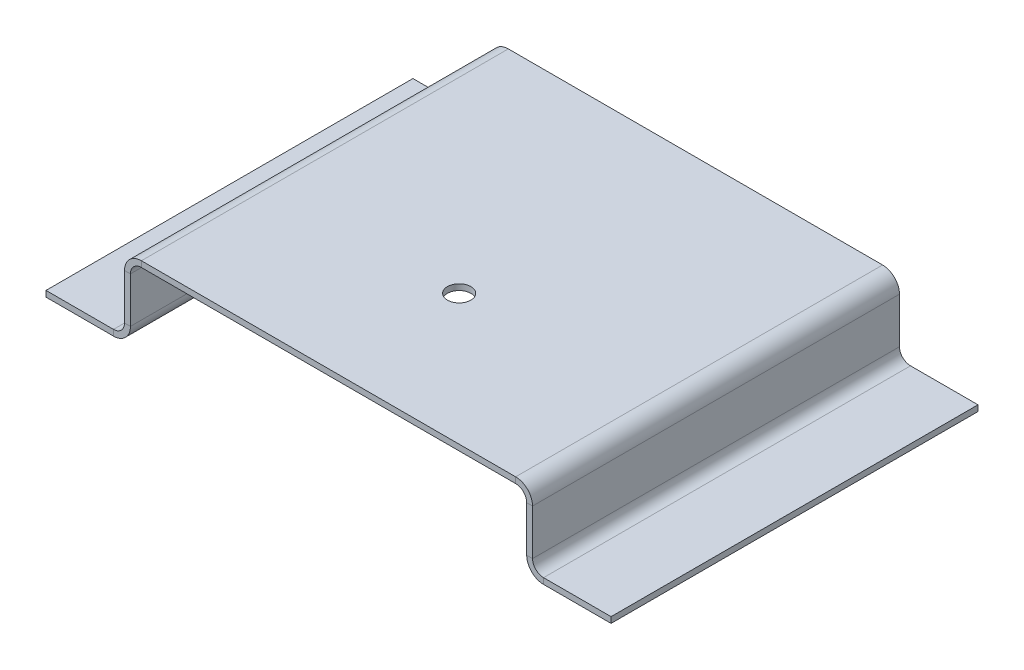
ISO-10303-21;
HEADER;
FILE_DESCRIPTION(('STEP AP214'),'2;1');
FILE_NAME('part.step','',(''),(''),'','','');
FILE_SCHEMA(('AUTOMOTIVE_DESIGN { 1 0 10303 214 1 1 1 1 }'));
ENDSEC;
DATA;
#1=APPLICATION_CONTEXT('core data for automotive mechanical design processes');
#2=APPLICATION_PROTOCOL_DEFINITION('international standard','automotive_design',2000,#1);
#3=PRODUCT_CONTEXT('',#1,'mechanical');
#4=PRODUCT('Part','Part','',(#3));
#5=PRODUCT_RELATED_PRODUCT_CATEGORY('part','',(#4));
#6=PRODUCT_DEFINITION_FORMATION('','',#4);
#7=PRODUCT_DEFINITION_CONTEXT('part definition',#1,'design');
#8=PRODUCT_DEFINITION('design','',#6,#7);
#9=PRODUCT_DEFINITION_SHAPE('','',#8);
#10=(LENGTH_UNIT() NAMED_UNIT(*) SI_UNIT(.MILLI.,.METRE.));
#11=(NAMED_UNIT(*) PLANE_ANGLE_UNIT() SI_UNIT($,.RADIAN.));
#12=(NAMED_UNIT(*) SI_UNIT($,.STERADIAN.) SOLID_ANGLE_UNIT());
#13=UNCERTAINTY_MEASURE_WITH_UNIT(LENGTH_MEASURE(1.E-05),#10,'distance_accuracy_value','');
#14=(GEOMETRIC_REPRESENTATION_CONTEXT(3) GLOBAL_UNCERTAINTY_ASSIGNED_CONTEXT((#13)) GLOBAL_UNIT_ASSIGNED_CONTEXT((#10,
#11,#12)) REPRESENTATION_CONTEXT('',''));
#15=CARTESIAN_POINT('',(0.,0.,0.));
#16=DIRECTION('',(0.,0.,1.));
#17=DIRECTION('',(1.,0.,0.));
#18=AXIS2_PLACEMENT_3D('',#15,#16,#17);
#19=CARTESIAN_POINT('',(27.,-7.7,25.));
#20=DIRECTION('',(0.,0.,1.));
#21=DIRECTION('',(1.,0.,0.));
#22=AXIS2_PLACEMENT_3D('',#19,#20,#21);
#23=PLANE('',#22);
#24=DIRECTION('',(1.,0.,0.));
#25=VECTOR('',#24,1.);
#26=CARTESIAN_POINT('',(27.,-7.7,25.));
#27=LINE('',#26,#25);
#28=CARTESIAN_POINT('',(27.,-7.7,25.));
#29=VERTEX_POINT('',#28);
#30=CARTESIAN_POINT('',(27.8,-7.7,25.));
#31=VERTEX_POINT('',#30);
#32=EDGE_CURVE('E11',#29,#31,#27,.T.);
#33=ORIENTED_EDGE('',*,*,#32,.F.);
#34=CARTESIAN_POINT('',(29.3,-7.7,25.));
#35=DIRECTION('',(0.,0.,1.));
#36=DIRECTION('',(1.,0.,0.));
#37=AXIS2_PLACEMENT_3D('',#34,#35,#36);
#38=CIRCLE('',#37,2.3);
#39=CARTESIAN_POINT('',(29.3,-10.,25.));
#40=VERTEX_POINT('',#39);
#41=EDGE_CURVE('E372',#40,#29,#38,.F.);
#42=ORIENTED_EDGE('',*,*,#41,.F.);
#43=DIRECTION('',(0.,-1.,0.));
#44=VECTOR('',#43,1.);
#45=CARTESIAN_POINT('',(29.3,-9.2,25.));
#46=LINE('',#45,#44);
#47=CARTESIAN_POINT('',(29.3,-9.2,25.));
#48=VERTEX_POINT('',#47);
#49=EDGE_CURVE('E50',#48,#40,#46,.T.);
#50=ORIENTED_EDGE('',*,*,#49,.F.);
#51=CARTESIAN_POINT('',(29.3,-7.7,25.));
#52=DIRECTION('',(0.,0.,1.));
#53=DIRECTION('',(1.,0.,0.));
#54=AXIS2_PLACEMENT_3D('',#51,#52,#53);
#55=CIRCLE('',#54,1.5);
#56=EDGE_CURVE('E385',#48,#31,#55,.F.);
#57=ORIENTED_EDGE('',*,*,#56,.T.);
#58=EDGE_LOOP('',(#33,#42,#50,#57));
#59=FACE_BOUND('',#58,.T.);
#60=ADVANCED_FACE('F42',(#59),#23,.T.);
#61=CARTESIAN_POINT('',(29.3,-9.2,25.));
#62=DIRECTION('',(0.,0.,1.));
#63=DIRECTION('',(1.,0.,0.));
#64=AXIS2_PLACEMENT_3D('',#61,#62,#63);
#65=PLANE('',#64);
#66=DIRECTION('',(0.,1.,0.));
#67=VECTOR('',#66,1.);
#68=CARTESIAN_POINT('',(27.,0.,25.));
#69=LINE('',#68,#67);
#70=CARTESIAN_POINT('',(27.,-1.5,25.));
#71=VERTEX_POINT('',#70);
#72=EDGE_CURVE('E376',#29,#71,#69,.T.);
#73=ORIENTED_EDGE('',*,*,#72,.F.);
#74=ORIENTED_EDGE('',*,*,#32,.T.);
#75=DIRECTION('',(0.,1.,0.));
#76=VECTOR('',#75,1.);
#77=CARTESIAN_POINT('',(27.8,0.,25.));
#78=LINE('',#77,#76);
#79=CARTESIAN_POINT('',(27.8,-1.5,25.));
#80=VERTEX_POINT('',#79);
#81=EDGE_CURVE('E387',#31,#80,#78,.T.);
#82=ORIENTED_EDGE('',*,*,#81,.T.);
#83=DIRECTION('',(-1.,0.,0.));
#84=VECTOR('',#83,1.);
#85=CARTESIAN_POINT('',(27.8,-1.5,25.));
#86=LINE('',#85,#84);
#87=EDGE_CURVE('E346',#80,#71,#86,.T.);
#88=ORIENTED_EDGE('',*,*,#87,.T.);
#89=EDGE_LOOP('',(#73,#74,#82,#88));
#90=FACE_BOUND('',#89,.T.);
#91=ADVANCED_FACE('F457',(#90),#65,.T.);
#92=CARTESIAN_POINT('',(29.3,-10.,-25.));
#93=DIRECTION('',(0.,0.,-1.));
#94=DIRECTION('',(-1.,0.,0.));
#95=AXIS2_PLACEMENT_3D('',#92,#93,#94);
#96=PLANE('',#95);
#97=DIRECTION('',(0.,1.,0.));
#98=VECTOR('',#97,1.);
#99=CARTESIAN_POINT('',(29.3,-10.,-25.));
#100=LINE('',#99,#98);
#101=CARTESIAN_POINT('',(29.3,-10.,-25.));
#102=VERTEX_POINT('',#101);
#103=CARTESIAN_POINT('',(29.3,-9.2,-25.));
#104=VERTEX_POINT('',#103);
#105=EDGE_CURVE('E352',#102,#104,#100,.T.);
#106=ORIENTED_EDGE('',*,*,#105,.F.);
#107=CARTESIAN_POINT('',(29.3,-7.7,-25.));
#108=DIRECTION('',(0.,0.,1.));
#109=DIRECTION('',(1.,0.,0.));
#110=AXIS2_PLACEMENT_3D('',#107,#108,#109);
#111=CIRCLE('',#110,2.3);
#112=CARTESIAN_POINT('',(27.,-7.7,-25.));
#113=VERTEX_POINT('',#112);
#114=EDGE_CURVE('E256',#102,#113,#111,.F.);
#115=ORIENTED_EDGE('',*,*,#114,.T.);
#116=DIRECTION('',(-1.,0.,0.));
#117=VECTOR('',#116,1.);
#118=CARTESIAN_POINT('',(27.8,-7.7,-25.));
#119=LINE('',#118,#117);
#120=CARTESIAN_POINT('',(27.8,-7.7,-25.));
#121=VERTEX_POINT('',#120);
#122=EDGE_CURVE('E350',#121,#113,#119,.T.);
#123=ORIENTED_EDGE('',*,*,#122,.F.);
#124=CARTESIAN_POINT('',(29.3,-7.7,-25.));
#125=DIRECTION('',(0.,0.,1.));
#126=DIRECTION('',(1.,0.,0.));
#127=AXIS2_PLACEMENT_3D('',#124,#125,#126);
#128=CIRCLE('',#127,1.5);
#129=EDGE_CURVE('E268',#104,#121,#128,.F.);
#130=ORIENTED_EDGE('',*,*,#129,.F.);
#131=EDGE_LOOP('',(#106,#115,#123,#130));
#132=FACE_BOUND('',#131,.T.);
#133=ADVANCED_FACE('F499',(#132),#96,.T.);
#134=CARTESIAN_POINT('',(27.8,-7.7,-25.));
#135=DIRECTION('',(0.,0.,-1.));
#136=DIRECTION('',(-1.,0.,0.));
#137=AXIS2_PLACEMENT_3D('',#134,#135,#136);
#138=PLANE('',#137);
#139=DIRECTION('',(-1.,0.,0.));
#140=VECTOR('',#139,1.);
#141=CARTESIAN_POINT('',(27.,-10.,-25.));
#142=LINE('',#141,#140);
#143=CARTESIAN_POINT('',(38.5,-9.99999999999999,-25.));
#144=VERTEX_POINT('',#143);
#145=EDGE_CURVE('E259',#144,#102,#142,.T.);
#146=ORIENTED_EDGE('',*,*,#145,.T.);
#147=ORIENTED_EDGE('',*,*,#105,.T.);
#148=DIRECTION('',(-1.,0.,0.));
#149=VECTOR('',#148,1.);
#150=CARTESIAN_POINT('',(27.,-9.2,-25.));
#151=LINE('',#150,#149);
#152=CARTESIAN_POINT('',(38.5,-9.2,-25.));
#153=VERTEX_POINT('',#152);
#154=EDGE_CURVE('E265',#153,#104,#151,.T.);
#155=ORIENTED_EDGE('',*,*,#154,.F.);
#156=DIRECTION('',(0.,-1.,0.));
#157=VECTOR('',#156,1.);
#158=CARTESIAN_POINT('',(38.5,-9.2,-25.));
#159=LINE('',#158,#157);
#160=EDGE_CURVE('E262',#153,#144,#159,.T.);
#161=ORIENTED_EDGE('',*,*,#160,.T.);
#162=EDGE_LOOP('',(#146,#147,#155,#161));
#163=FACE_BOUND('',#162,.T.);
#164=ADVANCED_FACE('F503',(#163),#138,.T.);
#165=CARTESIAN_POINT('',(25.5,0.,25.));
#166=DIRECTION('',(0.,0.,1.));
#167=DIRECTION('',(1.,0.,0.));
#168=AXIS2_PLACEMENT_3D('',#165,#166,#167);
#169=PLANE('',#168);
#170=DIRECTION('',(0.,1.,0.));
#171=VECTOR('',#170,1.);
#172=CARTESIAN_POINT('',(25.5,0.,25.));
#173=LINE('',#172,#171);
#174=CARTESIAN_POINT('',(25.5,0.,25.));
#175=VERTEX_POINT('',#174);
#176=CARTESIAN_POINT('',(25.5,0.800000000000002,25.));
#177=VERTEX_POINT('',#176);
#178=EDGE_CURVE('E348',#175,#177,#173,.T.);
#179=ORIENTED_EDGE('',*,*,#178,.F.);
#180=CARTESIAN_POINT('',(25.5,-1.5,25.));
#181=DIRECTION('',(0.,0.,-1.));
#182=DIRECTION('',(-1.,0.,0.));
#183=AXIS2_PLACEMENT_3D('',#180,#181,#182);
#184=CIRCLE('',#183,1.5);
#185=EDGE_CURVE('E447',#71,#175,#184,.F.);
#186=ORIENTED_EDGE('',*,*,#185,.F.);
#187=ORIENTED_EDGE('',*,*,#87,.F.);
#188=CARTESIAN_POINT('',(25.5,-1.5,25.));
#189=DIRECTION('',(0.,0.,1.));
#190=DIRECTION('',(1.,0.,0.));
#191=AXIS2_PLACEMENT_3D('',#188,#189,#190);
#192=CIRCLE('',#191,2.3);
#193=EDGE_CURVE('E390',#80,#177,#192,.T.);
#194=ORIENTED_EDGE('',*,*,#193,.T.);
#195=EDGE_LOOP('',(#179,#186,#187,#194));
#196=FACE_BOUND('',#195,.T.);
#197=ADVANCED_FACE('F464',(#196),#169,.T.);
#198=CARTESIAN_POINT('',(27.8,-1.5,25.));
#199=DIRECTION('',(0.,0.,1.));
#200=DIRECTION('',(1.,0.,0.));
#201=AXIS2_PLACEMENT_3D('',#198,#199,#200);
#202=PLANE('',#201);
#203=DIRECTION('',(-1.,0.,0.));
#204=VECTOR('',#203,1.);
#205=CARTESIAN_POINT('',(-27.,0.,25.));
#206=LINE('',#205,#204);
#207=CARTESIAN_POINT('',(-25.5,0.,25.));
#208=VERTEX_POINT('',#207);
#209=EDGE_CURVE('E444',#175,#208,#206,.T.);
#210=ORIENTED_EDGE('',*,*,#209,.F.);
#211=ORIENTED_EDGE('',*,*,#178,.T.);
#212=DIRECTION('',(1.,0.,0.));
#213=VECTOR('',#212,1.);
#214=CARTESIAN_POINT('',(-27.,0.800000000000002,25.));
#215=LINE('',#214,#213);
#216=CARTESIAN_POINT('',(-25.5,0.800000000000002,25.));
#217=VERTEX_POINT('',#216);
#218=EDGE_CURVE('E209',#177,#217,#215,.F.);
#219=ORIENTED_EDGE('',*,*,#218,.T.);
#220=DIRECTION('',(0.,-1.,0.));
#221=VECTOR('',#220,1.);
#222=CARTESIAN_POINT('',(-25.5,0.800000000000002,25.));
#223=LINE('',#222,#221);
#224=EDGE_CURVE('E200',#217,#208,#223,.T.);
#225=ORIENTED_EDGE('',*,*,#224,.T.);
#226=EDGE_LOOP('',(#210,#211,#219,#225));
#227=FACE_BOUND('',#226,.T.);
#228=ADVANCED_FACE('F396',(#227),#202,.T.);
#229=CARTESIAN_POINT('',(27.,-1.5,-25.));
#230=DIRECTION('',(0.,0.,-1.));
#231=DIRECTION('',(-1.,0.,0.));
#232=AXIS2_PLACEMENT_3D('',#229,#230,#231);
#233=PLANE('',#232);
#234=DIRECTION('',(1.,0.,0.));
#235=VECTOR('',#234,1.);
#236=CARTESIAN_POINT('',(27.,-1.5,-25.));
#237=LINE('',#236,#235);
#238=CARTESIAN_POINT('',(27.,-1.5,-25.));
#239=VERTEX_POINT('',#238);
#240=CARTESIAN_POINT('',(27.8,-1.5,-25.));
#241=VERTEX_POINT('',#240);
#242=EDGE_CURVE('E344',#239,#241,#237,.T.);
#243=ORIENTED_EDGE('',*,*,#242,.F.);
#244=CARTESIAN_POINT('',(25.5,-1.5,-25.));
#245=DIRECTION('',(0.,0.,-1.));
#246=DIRECTION('',(-1.,0.,0.));
#247=AXIS2_PLACEMENT_3D('',#244,#245,#246);
#248=CIRCLE('',#247,1.5);
#249=CARTESIAN_POINT('',(25.5,0.,-25.));
#250=VERTEX_POINT('',#249);
#251=EDGE_CURVE('E250',#239,#250,#248,.F.);
#252=ORIENTED_EDGE('',*,*,#251,.T.);
#253=DIRECTION('',(0.,-1.,0.));
#254=VECTOR('',#253,1.);
#255=CARTESIAN_POINT('',(25.5,0.800000000000002,-25.));
#256=LINE('',#255,#254);
#257=CARTESIAN_POINT('',(25.5,0.800000000000002,-25.));
#258=VERTEX_POINT('',#257);
#259=EDGE_CURVE('E199',#258,#250,#256,.T.);
#260=ORIENTED_EDGE('',*,*,#259,.F.);
#261=CARTESIAN_POINT('',(25.5,-1.5,-25.));
#262=DIRECTION('',(0.,0.,1.));
#263=DIRECTION('',(1.,0.,0.));
#264=AXIS2_PLACEMENT_3D('',#261,#262,#263);
#265=CIRCLE('',#264,2.3);
#266=EDGE_CURVE('E274',#241,#258,#265,.T.);
#267=ORIENTED_EDGE('',*,*,#266,.F.);
#268=EDGE_LOOP('',(#243,#252,#260,#267));
#269=FACE_BOUND('',#268,.T.);
#270=ADVANCED_FACE('F473',(#269),#233,.T.);
#271=CARTESIAN_POINT('',(25.5,0.800000000000002,-25.));
#272=DIRECTION('',(0.,0.,-1.));
#273=DIRECTION('',(-1.,0.,0.));
#274=AXIS2_PLACEMENT_3D('',#271,#272,#273);
#275=PLANE('',#274);
#276=DIRECTION('',(0.,1.,0.));
#277=VECTOR('',#276,1.);
#278=CARTESIAN_POINT('',(27.,0.,-25.));
#279=LINE('',#278,#277);
#280=EDGE_CURVE('E253',#113,#239,#279,.T.);
#281=ORIENTED_EDGE('',*,*,#280,.T.);
#282=ORIENTED_EDGE('',*,*,#242,.T.);
#283=DIRECTION('',(0.,1.,0.));
#284=VECTOR('',#283,1.);
#285=CARTESIAN_POINT('',(27.8,0.,-25.));
#286=LINE('',#285,#284);
#287=EDGE_CURVE('E271',#121,#241,#286,.T.);
#288=ORIENTED_EDGE('',*,*,#287,.F.);
#289=ORIENTED_EDGE('',*,*,#122,.T.);
#290=EDGE_LOOP('',(#281,#282,#288,#289));
#291=FACE_BOUND('',#290,.T.);
#292=ADVANCED_FACE('F477',(#291),#275,.T.);
#293=CARTESIAN_POINT('',(-27.,-1.5,25.));
#294=DIRECTION('',(0.,0.,1.));
#295=DIRECTION('',(1.,0.,0.));
#296=AXIS2_PLACEMENT_3D('',#293,#294,#295);
#297=PLANE('',#296);
#298=DIRECTION('',(-1.,0.,0.));
#299=VECTOR('',#298,1.);
#300=CARTESIAN_POINT('',(-27.,-1.5,25.));
#301=LINE('',#300,#299);
#302=CARTESIAN_POINT('',(-27.,-1.5,25.));
#303=VERTEX_POINT('',#302);
#304=CARTESIAN_POINT('',(-27.8,-1.5,25.));
#305=VERTEX_POINT('',#304);
#306=EDGE_CURVE('E187',#303,#305,#301,.T.);
#307=ORIENTED_EDGE('',*,*,#306,.F.);
#308=CARTESIAN_POINT('',(-25.5,-1.5,25.));
#309=DIRECTION('',(0.,0.,-1.));
#310=DIRECTION('',(-1.,0.,0.));
#311=AXIS2_PLACEMENT_3D('',#308,#309,#310);
#312=CIRCLE('',#311,1.5);
#313=EDGE_CURVE('E408',#208,#303,#312,.F.);
#314=ORIENTED_EDGE('',*,*,#313,.F.);
#315=ORIENTED_EDGE('',*,*,#224,.F.);
#316=CARTESIAN_POINT('',(-25.5,-1.5,25.));
#317=DIRECTION('',(0.,0.,1.));
#318=DIRECTION('',(1.,0.,0.));
#319=AXIS2_PLACEMENT_3D('',#316,#317,#318);
#320=CIRCLE('',#319,2.3);
#321=EDGE_CURVE('E203',#217,#305,#320,.T.);
#322=ORIENTED_EDGE('',*,*,#321,.T.);
#323=EDGE_LOOP('',(#307,#314,#315,#322));
#324=FACE_BOUND('',#323,.T.);
#325=ADVANCED_FACE('F205',(#324),#297,.T.);
#326=CARTESIAN_POINT('',(-25.5,0.800000000000002,25.));
#327=DIRECTION('',(0.,0.,1.));
#328=DIRECTION('',(1.,0.,0.));
#329=AXIS2_PLACEMENT_3D('',#326,#327,#328);
#330=PLANE('',#329);
#331=DIRECTION('',(0.,-1.,0.));
#332=VECTOR('',#331,1.);
#333=CARTESIAN_POINT('',(-27.,0.,25.));
#334=LINE('',#333,#332);
#335=CARTESIAN_POINT('',(-27.,-7.7,25.));
#336=VERTEX_POINT('',#335);
#337=EDGE_CURVE('E194',#303,#336,#334,.T.);
#338=ORIENTED_EDGE('',*,*,#337,.F.);
#339=ORIENTED_EDGE('',*,*,#306,.T.);
#340=DIRECTION('',(0.,1.,0.));
#341=VECTOR('',#340,1.);
#342=CARTESIAN_POINT('',(-27.8,0.,25.));
#343=LINE('',#342,#341);
#344=CARTESIAN_POINT('',(-27.8,-7.7,25.));
#345=VERTEX_POINT('',#344);
#346=EDGE_CURVE('E191',#305,#345,#343,.F.);
#347=ORIENTED_EDGE('',*,*,#346,.T.);
#348=DIRECTION('',(1.,0.,0.));
#349=VECTOR('',#348,1.);
#350=CARTESIAN_POINT('',(-27.8,-7.7,25.));
#351=LINE('',#350,#349);
#352=EDGE_CURVE('E335',#345,#336,#351,.T.);
#353=ORIENTED_EDGE('',*,*,#352,.T.);
#354=EDGE_LOOP('',(#338,#339,#347,#353));
#355=FACE_BOUND('',#354,.T.);
#356=ADVANCED_FACE('F189',(#355),#330,.T.);
#357=CARTESIAN_POINT('',(-25.5,0.,-25.));
#358=DIRECTION('',(0.,0.,-1.));
#359=DIRECTION('',(-1.,0.,0.));
#360=AXIS2_PLACEMENT_3D('',#357,#358,#359);
#361=PLANE('',#360);
#362=DIRECTION('',(0.,1.,0.));
#363=VECTOR('',#362,1.);
#364=CARTESIAN_POINT('',(-25.5,0.,-25.));
#365=LINE('',#364,#363);
#366=CARTESIAN_POINT('',(-25.5,0.,-25.));
#367=VERTEX_POINT('',#366);
#368=CARTESIAN_POINT('',(-25.5,0.800000000000002,-25.));
#369=VERTEX_POINT('',#368);
#370=EDGE_CURVE('E340',#367,#369,#365,.T.);
#371=ORIENTED_EDGE('',*,*,#370,.F.);
#372=CARTESIAN_POINT('',(-25.5,-1.5,-25.));
#373=DIRECTION('',(0.,0.,-1.));
#374=DIRECTION('',(-1.,0.,0.));
#375=AXIS2_PLACEMENT_3D('',#372,#373,#374);
#376=CIRCLE('',#375,1.5);
#377=CARTESIAN_POINT('',(-27.,-1.5,-25.));
#378=VERTEX_POINT('',#377);
#379=EDGE_CURVE('E244',#367,#378,#376,.F.);
#380=ORIENTED_EDGE('',*,*,#379,.T.);
#381=DIRECTION('',(1.,0.,0.));
#382=VECTOR('',#381,1.);
#383=CARTESIAN_POINT('',(-27.8,-1.5,-25.));
#384=LINE('',#383,#382);
#385=CARTESIAN_POINT('',(-27.8,-1.5,-25.));
#386=VERTEX_POINT('',#385);
#387=EDGE_CURVE('E338',#386,#378,#384,.T.);
#388=ORIENTED_EDGE('',*,*,#387,.F.);
#389=CARTESIAN_POINT('',(-25.5,-1.5,-25.));
#390=DIRECTION('',(0.,0.,1.));
#391=DIRECTION('',(1.,0.,0.));
#392=AXIS2_PLACEMENT_3D('',#389,#390,#391);
#393=CIRCLE('',#392,2.3);
#394=EDGE_CURVE('E216',#369,#386,#393,.T.);
#395=ORIENTED_EDGE('',*,*,#394,.F.);
#396=EDGE_LOOP('',(#371,#380,#388,#395));
#397=FACE_BOUND('',#396,.T.);
#398=ADVANCED_FACE('F402',(#397),#361,.T.);
#399=CARTESIAN_POINT('',(-27.8,-1.5,-25.));
#400=DIRECTION('',(0.,0.,-1.));
#401=DIRECTION('',(-1.,0.,0.));
#402=AXIS2_PLACEMENT_3D('',#399,#400,#401);
#403=PLANE('',#402);
#404=DIRECTION('',(-1.,0.,0.));
#405=VECTOR('',#404,1.);
#406=CARTESIAN_POINT('',(-27.,0.,-25.));
#407=LINE('',#406,#405);
#408=EDGE_CURVE('E247',#250,#367,#407,.T.);
#409=ORIENTED_EDGE('',*,*,#408,.T.);
#410=ORIENTED_EDGE('',*,*,#370,.T.);
#411=DIRECTION('',(1.,0.,0.));
#412=VECTOR('',#411,1.);
#413=CARTESIAN_POINT('',(-27.,0.800000000000002,-25.));
#414=LINE('',#413,#412);
#415=EDGE_CURVE('E277',#258,#369,#414,.F.);
#416=ORIENTED_EDGE('',*,*,#415,.F.);
#417=ORIENTED_EDGE('',*,*,#259,.T.);
#418=EDGE_LOOP('',(#409,#410,#416,#417));
#419=FACE_BOUND('',#418,.T.);
#420=ADVANCED_FACE('F483',(#419),#403,.T.);
#421=CARTESIAN_POINT('',(-29.3,-10.,25.));
#422=DIRECTION('',(0.,0.,1.));
#423=DIRECTION('',(1.,0.,0.));
#424=AXIS2_PLACEMENT_3D('',#421,#422,#423);
#425=PLANE('',#424);
#426=DIRECTION('',(0.,1.,0.));
#427=VECTOR('',#426,1.);
#428=CARTESIAN_POINT('',(-29.3,-10.,25.));
#429=LINE('',#428,#427);
#430=CARTESIAN_POINT('',(-29.3,-10.,25.));
#431=VERTEX_POINT('',#430);
#432=CARTESIAN_POINT('',(-29.3,-9.2,25.));
#433=VERTEX_POINT('',#432);
#434=EDGE_CURVE('E58',#431,#433,#429,.T.);
#435=ORIENTED_EDGE('',*,*,#434,.F.);
#436=CARTESIAN_POINT('',(-29.3,-7.7,25.));
#437=DIRECTION('',(0.,0.,1.));
#438=DIRECTION('',(1.,0.,0.));
#439=AXIS2_PLACEMENT_3D('',#436,#437,#438);
#440=CIRCLE('',#439,2.3);
#441=EDGE_CURVE('E436',#336,#431,#440,.F.);
#442=ORIENTED_EDGE('',*,*,#441,.F.);
#443=ORIENTED_EDGE('',*,*,#352,.F.);
#444=CARTESIAN_POINT('',(-29.3,-7.7,25.));
#445=DIRECTION('',(0.,0.,1.));
#446=DIRECTION('',(1.,0.,0.));
#447=AXIS2_PLACEMENT_3D('',#444,#445,#446);
#448=CIRCLE('',#447,1.5);
#449=EDGE_CURVE('E224',#345,#433,#448,.F.);
#450=ORIENTED_EDGE('',*,*,#449,.T.);
#451=EDGE_LOOP('',(#435,#442,#443,#450));
#452=FACE_BOUND('',#451,.T.);
#453=ADVANCED_FACE('F485',(#452),#425,.T.);
#454=CARTESIAN_POINT('',(-27.8,-7.7,25.));
#455=DIRECTION('',(0.,0.,1.));
#456=DIRECTION('',(1.,0.,0.));
#457=AXIS2_PLACEMENT_3D('',#454,#455,#456);
#458=PLANE('',#457);
#459=DIRECTION('',(-1.,0.,0.));
#460=VECTOR('',#459,1.);
#461=CARTESIAN_POINT('',(-27.,-10.,25.));
#462=LINE('',#461,#460);
#463=CARTESIAN_POINT('',(-38.5,-10.,25.));
#464=VERTEX_POINT('',#463);
#465=EDGE_CURVE('E434',#431,#464,#462,.T.);
#466=ORIENTED_EDGE('',*,*,#465,.F.);
#467=ORIENTED_EDGE('',*,*,#434,.T.);
#468=DIRECTION('',(-1.,0.,0.));
#469=VECTOR('',#468,1.);
#470=CARTESIAN_POINT('',(-27.,-9.2,25.));
#471=LINE('',#470,#469);
#472=CARTESIAN_POINT('',(-38.5,-9.2,25.));
#473=VERTEX_POINT('',#472);
#474=EDGE_CURVE('E136',#433,#473,#471,.T.);
#475=ORIENTED_EDGE('',*,*,#474,.T.);
#476=DIRECTION('',(0.,1.,0.));
#477=VECTOR('',#476,1.);
#478=CARTESIAN_POINT('',(-38.5,-10.,25.));
#479=LINE('',#478,#477);
#480=EDGE_CURVE('E432',#464,#473,#479,.T.);
#481=ORIENTED_EDGE('',*,*,#480,.F.);
#482=EDGE_LOOP('',(#466,#467,#475,#481));
#483=FACE_BOUND('',#482,.T.);
#484=ADVANCED_FACE('F491',(#483),#458,.T.);
#485=CARTESIAN_POINT('',(-27.,-7.7,-25.));
#486=DIRECTION('',(0.,0.,-1.));
#487=DIRECTION('',(-1.,0.,0.));
#488=AXIS2_PLACEMENT_3D('',#485,#486,#487);
#489=PLANE('',#488);
#490=DIRECTION('',(-1.,0.,0.));
#491=VECTOR('',#490,1.);
#492=CARTESIAN_POINT('',(-27.,-7.7,-25.));
#493=LINE('',#492,#491);
#494=CARTESIAN_POINT('',(-27.,-7.7,-25.));
#495=VERTEX_POINT('',#494);
#496=CARTESIAN_POINT('',(-27.8,-7.7,-25.));
#497=VERTEX_POINT('',#496);
#498=EDGE_CURVE('E123',#495,#497,#493,.T.);
#499=ORIENTED_EDGE('',*,*,#498,.F.);
#500=CARTESIAN_POINT('',(-29.3,-7.7,-25.));
#501=DIRECTION('',(0.,0.,1.));
#502=DIRECTION('',(1.,0.,0.));
#503=AXIS2_PLACEMENT_3D('',#500,#501,#502);
#504=CIRCLE('',#503,2.3);
#505=CARTESIAN_POINT('',(-29.3,-10.,-25.));
#506=VERTEX_POINT('',#505);
#507=EDGE_CURVE('E240',#495,#506,#504,.F.);
#508=ORIENTED_EDGE('',*,*,#507,.T.);
#509=DIRECTION('',(0.,-1.,0.));
#510=VECTOR('',#509,1.);
#511=CARTESIAN_POINT('',(-29.3,-9.2,-25.));
#512=LINE('',#511,#510);
#513=CARTESIAN_POINT('',(-29.3,-9.2,-25.));
#514=VERTEX_POINT('',#513);
#515=EDGE_CURVE('E130',#514,#506,#512,.T.);
#516=ORIENTED_EDGE('',*,*,#515,.F.);
#517=CARTESIAN_POINT('',(-29.3,-7.7,-25.));
#518=DIRECTION('',(0.,0.,1.));
#519=DIRECTION('',(1.,0.,0.));
#520=AXIS2_PLACEMENT_3D('',#517,#518,#519);
#521=CIRCLE('',#520,1.5);
#522=EDGE_CURVE('E283',#497,#514,#521,.F.);
#523=ORIENTED_EDGE('',*,*,#522,.F.);
#524=EDGE_LOOP('',(#499,#508,#516,#523));
#525=FACE_BOUND('',#524,.T.);
#526=ADVANCED_FACE('F419',(#525),#489,.T.);
#527=CARTESIAN_POINT('',(-29.3,-9.2,-25.));
#528=DIRECTION('',(0.,0.,-1.));
#529=DIRECTION('',(-1.,0.,0.));
#530=AXIS2_PLACEMENT_3D('',#527,#528,#529);
#531=PLANE('',#530);
#532=DIRECTION('',(0.,-1.,0.));
#533=VECTOR('',#532,1.);
#534=CARTESIAN_POINT('',(-27.,0.,-25.));
#535=LINE('',#534,#533);
#536=EDGE_CURVE('E242',#378,#495,#535,.T.);
#537=ORIENTED_EDGE('',*,*,#536,.T.);
#538=ORIENTED_EDGE('',*,*,#498,.T.);
#539=DIRECTION('',(0.,1.,0.));
#540=VECTOR('',#539,1.);
#541=CARTESIAN_POINT('',(-27.8,0.,-25.));
#542=LINE('',#541,#540);
#543=EDGE_CURVE('E281',#386,#497,#542,.F.);
#544=ORIENTED_EDGE('',*,*,#543,.F.);
#545=ORIENTED_EDGE('',*,*,#387,.T.);
#546=EDGE_LOOP('',(#537,#538,#544,#545));
#547=FACE_BOUND('',#546,.T.);
#548=ADVANCED_FACE('F404',(#547),#531,.T.);
#549=CARTESIAN_POINT('',(-27.,-9.2,25.));
#550=DIRECTION('',(0.,-1.,0.));
#551=DIRECTION('',(1.,0.,0.));
#552=AXIS2_PLACEMENT_3D('',#549,#550,#551);
#553=PLANE('',#552);
#554=DIRECTION('',(-1.,0.,0.));
#555=VECTOR('',#554,1.);
#556=CARTESIAN_POINT('',(-27.,-9.2,-25.));
#557=LINE('',#556,#555);
#558=CARTESIAN_POINT('',(-38.5,-9.2,-25.));
#559=VERTEX_POINT('',#558);
#560=EDGE_CURVE('E230',#514,#559,#557,.T.);
#561=ORIENTED_EDGE('',*,*,#560,.T.);
#562=DIRECTION('',(0.,0.,-1.));
#563=VECTOR('',#562,1.);
#564=CARTESIAN_POINT('',(-38.5,-9.2,25.));
#565=LINE('',#564,#563);
#566=EDGE_CURVE('E331',#473,#559,#565,.T.);
#567=ORIENTED_EDGE('',*,*,#566,.F.);
#568=ORIENTED_EDGE('',*,*,#474,.F.);
#569=DIRECTION('',(0.,0.,-1.));
#570=VECTOR('',#569,1.);
#571=CARTESIAN_POINT('',(-29.3,-9.2,25.));
#572=LINE('',#571,#570);
#573=EDGE_CURVE('E226',#433,#514,#572,.T.);
#574=ORIENTED_EDGE('',*,*,#573,.T.);
#575=EDGE_LOOP('',(#561,#567,#568,#574));
#576=FACE_BOUND('',#575,.T.);
#577=ADVANCED_FACE('F425',(#576),#553,.F.);
#578=CARTESIAN_POINT('',(-38.5,-10.,25.));
#579=DIRECTION('',(-1.,0.,0.));
#580=DIRECTION('',(0.,0.,1.));
#581=AXIS2_PLACEMENT_3D('',#578,#579,#580);
#582=PLANE('',#581);
#583=DIRECTION('',(0.,1.,0.));
#584=VECTOR('',#583,1.);
#585=CARTESIAN_POINT('',(-38.5,-10.,-25.));
#586=LINE('',#585,#584);
#587=CARTESIAN_POINT('',(-38.5,-10.,-25.));
#588=VERTEX_POINT('',#587);
#589=EDGE_CURVE('E233',#588,#559,#586,.T.);
#590=ORIENTED_EDGE('',*,*,#589,.F.);
#591=DIRECTION('',(0.,0.,-1.));
#592=VECTOR('',#591,1.);
#593=CARTESIAN_POINT('',(-38.5,-10.,25.));
#594=LINE('',#593,#592);
#595=EDGE_CURVE('E329',#464,#588,#594,.T.);
#596=ORIENTED_EDGE('',*,*,#595,.F.);
#597=ORIENTED_EDGE('',*,*,#480,.T.);
#598=ORIENTED_EDGE('',*,*,#566,.T.);
#599=EDGE_LOOP('',(#590,#596,#597,#598));
#600=FACE_BOUND('',#599,.T.);
#601=ADVANCED_FACE('F430',(#600),#582,.T.);
#602=CARTESIAN_POINT('',(-27.,-10.,25.));
#603=DIRECTION('',(0.,-1.,0.));
#604=DIRECTION('',(1.,0.,0.));
#605=AXIS2_PLACEMENT_3D('',#602,#603,#604);
#606=PLANE('',#605);
#607=DIRECTION('',(-1.,0.,0.));
#608=VECTOR('',#607,1.);
#609=CARTESIAN_POINT('',(-27.,-10.,-25.));
#610=LINE('',#609,#608);
#611=EDGE_CURVE('E237',#506,#588,#610,.T.);
#612=ORIENTED_EDGE('',*,*,#611,.F.);
#613=DIRECTION('',(0.,0.,-1.));
#614=VECTOR('',#613,1.);
#615=CARTESIAN_POINT('',(-29.3,-10.,25.));
#616=LINE('',#615,#614);
#617=EDGE_CURVE('E326',#431,#506,#616,.T.);
#618=ORIENTED_EDGE('',*,*,#617,.F.);
#619=ORIENTED_EDGE('',*,*,#465,.T.);
#620=ORIENTED_EDGE('',*,*,#595,.T.);
#621=EDGE_LOOP('',(#612,#618,#619,#620));
#622=FACE_BOUND('',#621,.T.);
#623=ADVANCED_FACE('F586',(#622),#606,.T.);
#624=CARTESIAN_POINT('',(-29.3,-7.7,25.));
#625=DIRECTION('',(0.,0.,-1.));
#626=DIRECTION('',(-1.,0.,0.));
#627=AXIS2_PLACEMENT_3D('',#624,#625,#626);
#628=CYLINDRICAL_SURFACE('',#627,2.3);
#629=ORIENTED_EDGE('',*,*,#507,.F.);
#630=DIRECTION('',(0.,0.,-1.));
#631=VECTOR('',#630,1.);
#632=CARTESIAN_POINT('',(-27.,-7.7,25.));
#633=LINE('',#632,#631);
#634=EDGE_CURVE('E323',#336,#495,#633,.T.);
#635=ORIENTED_EDGE('',*,*,#634,.F.);
#636=ORIENTED_EDGE('',*,*,#441,.T.);
#637=ORIENTED_EDGE('',*,*,#617,.T.);
#638=EDGE_LOOP('',(#629,#635,#636,#637));
#639=FACE_BOUND('',#638,.T.);
#640=ADVANCED_FACE('F416',(#639),#628,.T.);
#641=CARTESIAN_POINT('',(-27.,0.,25.));
#642=DIRECTION('',(1.,0.,0.));
#643=DIRECTION('',(0.,0.,-1.));
#644=AXIS2_PLACEMENT_3D('',#641,#642,#643);
#645=PLANE('',#644);
#646=ORIENTED_EDGE('',*,*,#536,.F.);
#647=DIRECTION('',(0.,0.,-1.));
#648=VECTOR('',#647,1.);
#649=CARTESIAN_POINT('',(-27.,-1.5,25.));
#650=LINE('',#649,#648);
#651=EDGE_CURVE('E320',#303,#378,#650,.T.);
#652=ORIENTED_EDGE('',*,*,#651,.F.);
#653=ORIENTED_EDGE('',*,*,#337,.T.);
#654=ORIENTED_EDGE('',*,*,#634,.T.);
#655=EDGE_LOOP('',(#646,#652,#653,#654));
#656=FACE_BOUND('',#655,.T.);
#657=ADVANCED_FACE('F410',(#656),#645,.T.);
#658=CARTESIAN_POINT('',(-25.5,-1.5,25.));
#659=DIRECTION('',(0.,0.,-1.));
#660=DIRECTION('',(-1.,0.,0.));
#661=AXIS2_PLACEMENT_3D('',#658,#659,#660);
#662=CYLINDRICAL_SURFACE('',#661,1.5);
#663=ORIENTED_EDGE('',*,*,#379,.F.);
#664=DIRECTION('',(0.,0.,-1.));
#665=VECTOR('',#664,1.);
#666=CARTESIAN_POINT('',(-25.5,0.,25.));
#667=LINE('',#666,#665);
#668=EDGE_CURVE('E317',#208,#367,#667,.T.);
#669=ORIENTED_EDGE('',*,*,#668,.F.);
#670=ORIENTED_EDGE('',*,*,#313,.T.);
#671=ORIENTED_EDGE('',*,*,#651,.T.);
#672=EDGE_LOOP('',(#663,#669,#670,#671));
#673=FACE_BOUND('',#672,.T.);
#674=ADVANCED_FACE('F407',(#673),#662,.F.);
#675=CARTESIAN_POINT('',(-27.,0.,25.));
#676=DIRECTION('',(0.,-1.,0.));
#677=DIRECTION('',(0.,0.,-1.));
#678=AXIS2_PLACEMENT_3D('',#675,#676,#677);
#679=PLANE('',#678);
#680=CARTESIAN_POINT('',(0.,0.,7.2));
#681=DIRECTION('',(0.,-1.,0.));
#682=DIRECTION('',(0.,0.,-1.));
#683=AXIS2_PLACEMENT_3D('',#680,#681,#682);
#684=CIRCLE('',#683,1.6);
#685=CARTESIAN_POINT('',(0.,0.,5.6));
#686=VERTEX_POINT('',#685);
#687=EDGE_CURVE('E234',#686,#686,#684,.T.);
#688=ORIENTED_EDGE('',*,*,#687,.F.);
#689=EDGE_LOOP('',(#688));
#690=FACE_BOUND('',#689,.T.);
#691=ORIENTED_EDGE('',*,*,#408,.F.);
#692=DIRECTION('',(0.,0.,-1.));
#693=VECTOR('',#692,1.);
#694=CARTESIAN_POINT('',(25.5,0.,25.));
#695=LINE('',#694,#693);
#696=EDGE_CURVE('E314',#175,#250,#695,.T.);
#697=ORIENTED_EDGE('',*,*,#696,.F.);
#698=ORIENTED_EDGE('',*,*,#209,.T.);
#699=ORIENTED_EDGE('',*,*,#668,.T.);
#700=EDGE_LOOP('',(#691,#697,#698,#699));
#701=FACE_BOUND('',#700,.T.);
#702=ADVANCED_FACE('F470',(#690,#701),#679,.T.);
#703=CARTESIAN_POINT('',(25.5,-1.5,25.));
#704=DIRECTION('',(0.,0.,-1.));
#705=DIRECTION('',(-1.,0.,0.));
#706=AXIS2_PLACEMENT_3D('',#703,#704,#705);
#707=CYLINDRICAL_SURFACE('',#706,1.5);
#708=ORIENTED_EDGE('',*,*,#251,.F.);
#709=DIRECTION('',(0.,0.,-1.));
#710=VECTOR('',#709,1.);
#711=CARTESIAN_POINT('',(27.,-1.5,25.));
#712=LINE('',#711,#710);
#713=EDGE_CURVE('E311',#71,#239,#712,.T.);
#714=ORIENTED_EDGE('',*,*,#713,.F.);
#715=ORIENTED_EDGE('',*,*,#185,.T.);
#716=ORIENTED_EDGE('',*,*,#696,.T.);
#717=EDGE_LOOP('',(#708,#714,#715,#716));
#718=FACE_BOUND('',#717,.T.);
#719=ADVANCED_FACE('F463',(#718),#707,.F.);
#720=CARTESIAN_POINT('',(27.,0.,25.));
#721=DIRECTION('',(-1.,0.,0.));
#722=DIRECTION('',(0.,0.,1.));
#723=AXIS2_PLACEMENT_3D('',#720,#721,#722);
#724=PLANE('',#723);
#725=ORIENTED_EDGE('',*,*,#280,.F.);
#726=DIRECTION('',(0.,0.,-1.));
#727=VECTOR('',#726,1.);
#728=CARTESIAN_POINT('',(27.,-7.7,25.));
#729=LINE('',#728,#727);
#730=EDGE_CURVE('E308',#29,#113,#729,.T.);
#731=ORIENTED_EDGE('',*,*,#730,.F.);
#732=ORIENTED_EDGE('',*,*,#72,.T.);
#733=ORIENTED_EDGE('',*,*,#713,.T.);
#734=EDGE_LOOP('',(#725,#731,#732,#733));
#735=FACE_BOUND('',#734,.T.);
#736=ADVANCED_FACE('F453',(#735),#724,.T.);
#737=CARTESIAN_POINT('',(29.3,-7.7,25.));
#738=DIRECTION('',(0.,0.,-1.));
#739=DIRECTION('',(-1.,0.,0.));
#740=AXIS2_PLACEMENT_3D('',#737,#738,#739);
#741=CYLINDRICAL_SURFACE('',#740,2.3);
#742=ORIENTED_EDGE('',*,*,#114,.F.);
#743=DIRECTION('',(0.,0.,-1.));
#744=VECTOR('',#743,1.);
#745=CARTESIAN_POINT('',(29.3,-10.,25.));
#746=LINE('',#745,#744);
#747=EDGE_CURVE('E305',#40,#102,#746,.T.);
#748=ORIENTED_EDGE('',*,*,#747,.F.);
#749=ORIENTED_EDGE('',*,*,#41,.T.);
#750=ORIENTED_EDGE('',*,*,#730,.T.);
#751=EDGE_LOOP('',(#742,#748,#749,#750));
#752=FACE_BOUND('',#751,.T.);
#753=ADVANCED_FACE('F371',(#752),#741,.T.);
#754=CARTESIAN_POINT('',(27.,-10.,25.));
#755=DIRECTION('',(0.,-1.,0.));
#756=DIRECTION('',(1.,0.,0.));
#757=AXIS2_PLACEMENT_3D('',#754,#755,#756);
#758=PLANE('',#757);
#759=ORIENTED_EDGE('',*,*,#145,.F.);
#760=DIRECTION('',(0.,0.,-1.));
#761=VECTOR('',#760,1.);
#762=CARTESIAN_POINT('',(38.5,-9.99999999999999,25.));
#763=LINE('',#762,#761);
#764=CARTESIAN_POINT('',(38.5,-9.99999999999999,25.));
#765=VERTEX_POINT('',#764);
#766=EDGE_CURVE('E303',#765,#144,#763,.T.);
#767=ORIENTED_EDGE('',*,*,#766,.F.);
#768=DIRECTION('',(-1.,0.,0.));
#769=VECTOR('',#768,1.);
#770=CARTESIAN_POINT('',(27.,-10.,25.));
#771=LINE('',#770,#769);
#772=EDGE_CURVE('E360',#765,#40,#771,.T.);
#773=ORIENTED_EDGE('',*,*,#772,.T.);
#774=ORIENTED_EDGE('',*,*,#747,.T.);
#775=EDGE_LOOP('',(#759,#767,#773,#774));
#776=FACE_BOUND('',#775,.T.);
#777=ADVANCED_FACE('F378',(#776),#758,.T.);
#778=CARTESIAN_POINT('',(38.5,-9.2,25.));
#779=DIRECTION('',(1.,0.,0.));
#780=DIRECTION('',(0.,0.,-1.));
#781=AXIS2_PLACEMENT_3D('',#778,#779,#780);
#782=PLANE('',#781);
#783=ORIENTED_EDGE('',*,*,#160,.F.);
#784=DIRECTION('',(0.,0.,-1.));
#785=VECTOR('',#784,1.);
#786=CARTESIAN_POINT('',(38.5,-9.2,25.));
#787=LINE('',#786,#785);
#788=CARTESIAN_POINT('',(38.5,-9.2,25.));
#789=VERTEX_POINT('',#788);
#790=EDGE_CURVE('E301',#789,#153,#787,.T.);
#791=ORIENTED_EDGE('',*,*,#790,.F.);
#792=DIRECTION('',(0.,-1.,0.));
#793=VECTOR('',#792,1.);
#794=CARTESIAN_POINT('',(38.5,-9.2,25.));
#795=LINE('',#794,#793);
#796=EDGE_CURVE('E379',#789,#765,#795,.T.);
#797=ORIENTED_EDGE('',*,*,#796,.T.);
#798=ORIENTED_EDGE('',*,*,#766,.T.);
#799=EDGE_LOOP('',(#783,#791,#797,#798));
#800=FACE_BOUND('',#799,.T.);
#801=ADVANCED_FACE('F664',(#800),#782,.T.);
#802=CARTESIAN_POINT('',(27.,-9.2,25.));
#803=DIRECTION('',(0.,-1.,0.));
#804=DIRECTION('',(1.,0.,0.));
#805=AXIS2_PLACEMENT_3D('',#802,#803,#804);
#806=PLANE('',#805);
#807=ORIENTED_EDGE('',*,*,#154,.T.);
#808=DIRECTION('',(0.,0.,-1.));
#809=VECTOR('',#808,1.);
#810=CARTESIAN_POINT('',(29.3,-9.2,25.));
#811=LINE('',#810,#809);
#812=EDGE_CURVE('E298',#48,#104,#811,.T.);
#813=ORIENTED_EDGE('',*,*,#812,.F.);
#814=DIRECTION('',(-1.,0.,0.));
#815=VECTOR('',#814,1.);
#816=CARTESIAN_POINT('',(27.,-9.2,25.));
#817=LINE('',#816,#815);
#818=EDGE_CURVE('E363',#789,#48,#817,.T.);
#819=ORIENTED_EDGE('',*,*,#818,.F.);
#820=ORIENTED_EDGE('',*,*,#790,.T.);
#821=EDGE_LOOP('',(#807,#813,#819,#820));
#822=FACE_BOUND('',#821,.T.);
#823=ADVANCED_FACE('F673',(#822),#806,.F.);
#824=CARTESIAN_POINT('',(29.3,-7.7,25.));
#825=DIRECTION('',(0.,0.,-1.));
#826=DIRECTION('',(-1.,0.,0.));
#827=AXIS2_PLACEMENT_3D('',#824,#825,#826);
#828=CYLINDRICAL_SURFACE('',#827,1.5);
#829=ORIENTED_EDGE('',*,*,#129,.T.);
#830=DIRECTION('',(0.,0.,-1.));
#831=VECTOR('',#830,1.);
#832=CARTESIAN_POINT('',(27.8,-7.7,25.));
#833=LINE('',#832,#831);
#834=EDGE_CURVE('E295',#31,#121,#833,.T.);
#835=ORIENTED_EDGE('',*,*,#834,.F.);
#836=ORIENTED_EDGE('',*,*,#56,.F.);
#837=ORIENTED_EDGE('',*,*,#812,.T.);
#838=EDGE_LOOP('',(#829,#835,#836,#837));
#839=FACE_BOUND('',#838,.T.);
#840=ADVANCED_FACE('F683',(#839),#828,.F.);
#841=CARTESIAN_POINT('',(27.8,0.,25.));
#842=DIRECTION('',(-1.,0.,0.));
#843=DIRECTION('',(0.,0.,1.));
#844=AXIS2_PLACEMENT_3D('',#841,#842,#843);
#845=PLANE('',#844);
#846=ORIENTED_EDGE('',*,*,#287,.T.);
#847=DIRECTION('',(0.,0.,-1.));
#848=VECTOR('',#847,1.);
#849=CARTESIAN_POINT('',(27.8,-1.5,25.));
#850=LINE('',#849,#848);
#851=EDGE_CURVE('E292',#80,#241,#850,.T.);
#852=ORIENTED_EDGE('',*,*,#851,.F.);
#853=ORIENTED_EDGE('',*,*,#81,.F.);
#854=ORIENTED_EDGE('',*,*,#834,.T.);
#855=EDGE_LOOP('',(#846,#852,#853,#854));
#856=FACE_BOUND('',#855,.T.);
#857=ADVANCED_FACE('F479',(#856),#845,.F.);
#858=CARTESIAN_POINT('',(25.5,-1.5,25.));
#859=DIRECTION('',(0.,0.,-1.));
#860=DIRECTION('',(-1.,0.,0.));
#861=AXIS2_PLACEMENT_3D('',#858,#859,#860);
#862=CYLINDRICAL_SURFACE('',#861,2.3);
#863=ORIENTED_EDGE('',*,*,#266,.T.);
#864=DIRECTION('',(0.,0.,-1.));
#865=VECTOR('',#864,1.);
#866=CARTESIAN_POINT('',(25.5,0.800000000000002,25.));
#867=LINE('',#866,#865);
#868=EDGE_CURVE('E289',#177,#258,#867,.T.);
#869=ORIENTED_EDGE('',*,*,#868,.F.);
#870=ORIENTED_EDGE('',*,*,#193,.F.);
#871=ORIENTED_EDGE('',*,*,#851,.T.);
#872=EDGE_LOOP('',(#863,#869,#870,#871));
#873=FACE_BOUND('',#872,.T.);
#874=ADVANCED_FACE('F482',(#873),#862,.T.);
#875=CARTESIAN_POINT('',(-27.,0.800000000000002,25.));
#876=DIRECTION('',(0.,-1.,0.));
#877=DIRECTION('',(0.,0.,-1.));
#878=AXIS2_PLACEMENT_3D('',#875,#876,#877);
#879=PLANE('',#878);
#880=CARTESIAN_POINT('',(0.,0.800000000000002,7.2));
#881=DIRECTION('',(0.,1.,0.));
#882=DIRECTION('',(0.,0.,1.));
#883=AXIS2_PLACEMENT_3D('',#880,#881,#882);
#884=CIRCLE('',#883,1.6);
#885=CARTESIAN_POINT('',(0.,0.800000000000002,8.80000000000001));
#886=VERTEX_POINT('',#885);
#887=EDGE_CURVE('E818',#886,#886,#884,.T.);
#888=ORIENTED_EDGE('',*,*,#887,.F.);
#889=EDGE_LOOP('',(#888));
#890=FACE_BOUND('',#889,.T.);
#891=ORIENTED_EDGE('',*,*,#415,.T.);
#892=DIRECTION('',(0.,0.,-1.));
#893=VECTOR('',#892,1.);
#894=CARTESIAN_POINT('',(-25.5,0.800000000000002,25.));
#895=LINE('',#894,#893);
#896=EDGE_CURVE('E218',#217,#369,#895,.T.);
#897=ORIENTED_EDGE('',*,*,#896,.F.);
#898=ORIENTED_EDGE('',*,*,#218,.F.);
#899=ORIENTED_EDGE('',*,*,#868,.T.);
#900=EDGE_LOOP('',(#891,#897,#898,#899));
#901=FACE_BOUND('',#900,.T.);
#902=ADVANCED_FACE('F399',(#890,#901),#879,.F.);
#903=CARTESIAN_POINT('',(-25.5,-1.5,25.));
#904=DIRECTION('',(0.,0.,-1.));
#905=DIRECTION('',(-1.,0.,0.));
#906=AXIS2_PLACEMENT_3D('',#903,#904,#905);
#907=CYLINDRICAL_SURFACE('',#906,2.3);
#908=ORIENTED_EDGE('',*,*,#394,.T.);
#909=DIRECTION('',(0.,0.,-1.));
#910=VECTOR('',#909,1.);
#911=CARTESIAN_POINT('',(-27.8,-1.5,25.));
#912=LINE('',#911,#910);
#913=EDGE_CURVE('E213',#305,#386,#912,.T.);
#914=ORIENTED_EDGE('',*,*,#913,.F.);
#915=ORIENTED_EDGE('',*,*,#321,.F.);
#916=ORIENTED_EDGE('',*,*,#896,.T.);
#917=EDGE_LOOP('',(#908,#914,#915,#916));
#918=FACE_BOUND('',#917,.T.);
#919=ADVANCED_FACE('F214',(#918),#907,.T.);
#920=CARTESIAN_POINT('',(-27.8,0.,25.));
#921=DIRECTION('',(1.,0.,0.));
#922=DIRECTION('',(0.,0.,-1.));
#923=AXIS2_PLACEMENT_3D('',#920,#921,#922);
#924=PLANE('',#923);
#925=ORIENTED_EDGE('',*,*,#543,.T.);
#926=DIRECTION('',(0.,0.,-1.));
#927=VECTOR('',#926,1.);
#928=CARTESIAN_POINT('',(-27.8,-7.7,25.));
#929=LINE('',#928,#927);
#930=EDGE_CURVE('E219',#345,#497,#929,.T.);
#931=ORIENTED_EDGE('',*,*,#930,.F.);
#932=ORIENTED_EDGE('',*,*,#346,.F.);
#933=ORIENTED_EDGE('',*,*,#913,.T.);
#934=EDGE_LOOP('',(#925,#931,#932,#933));
#935=FACE_BOUND('',#934,.T.);
#936=ADVANCED_FACE('F221',(#935),#924,.F.);
#937=CARTESIAN_POINT('',(-29.3,-7.7,25.));
#938=DIRECTION('',(0.,0.,-1.));
#939=DIRECTION('',(-1.,0.,0.));
#940=AXIS2_PLACEMENT_3D('',#937,#938,#939);
#941=CYLINDRICAL_SURFACE('',#940,1.5);
#942=ORIENTED_EDGE('',*,*,#522,.T.);
#943=ORIENTED_EDGE('',*,*,#573,.F.);
#944=ORIENTED_EDGE('',*,*,#449,.F.);
#945=ORIENTED_EDGE('',*,*,#930,.T.);
#946=EDGE_LOOP('',(#942,#943,#944,#945));
#947=FACE_BOUND('',#946,.T.);
#948=ADVANCED_FACE('F422',(#947),#941,.F.);
#949=CARTESIAN_POINT('',(-29.3,-7.7,25.));
#950=DIRECTION('',(0.,0.,1.));
#951=DIRECTION('',(1.,0.,0.));
#952=AXIS2_PLACEMENT_3D('',#949,#950,#951);
#953=PLANE('',#952);
#954=ORIENTED_EDGE('',*,*,#818,.T.);
#955=ORIENTED_EDGE('',*,*,#49,.T.);
#956=ORIENTED_EDGE('',*,*,#772,.F.);
#957=ORIENTED_EDGE('',*,*,#796,.F.);
#958=EDGE_LOOP('',(#954,#955,#956,#957));
#959=FACE_BOUND('',#958,.T.);
#960=ADVANCED_FACE('F357',(#959),#953,.T.);
#961=CARTESIAN_POINT('',(-29.3,-7.7,-25.));
#962=DIRECTION('',(0.,0.,1.));
#963=DIRECTION('',(1.,0.,0.));
#964=AXIS2_PLACEMENT_3D('',#961,#962,#963);
#965=PLANE('',#964);
#966=ORIENTED_EDGE('',*,*,#560,.F.);
#967=ORIENTED_EDGE('',*,*,#515,.T.);
#968=ORIENTED_EDGE('',*,*,#611,.T.);
#969=ORIENTED_EDGE('',*,*,#589,.T.);
#970=EDGE_LOOP('',(#966,#967,#968,#969));
#971=FACE_BOUND('',#970,.T.);
#972=ADVANCED_FACE('F427',(#971),#965,.F.);
#973=CARTESIAN_POINT('',(0.,-9.2,7.2));
#974=DIRECTION('',(0.,1.,0.));
#975=DIRECTION('',(0.,0.,1.));
#976=AXIS2_PLACEMENT_3D('',#973,#974,#975);
#977=CYLINDRICAL_SURFACE('',#976,1.6);
#978=ORIENTED_EDGE('',*,*,#687,.T.);
#979=EDGE_LOOP('',(#978));
#980=FACE_BOUND('',#979,.T.);
#981=ORIENTED_EDGE('',*,*,#887,.T.);
#982=EDGE_LOOP('',(#981));
#983=FACE_BOUND('',#982,.T.);
#984=ADVANCED_FACE('F756',(#980,#983),#977,.F.);
#985=CLOSED_SHELL('',(#60,#91,#133,#164,#197,#228,#270,#292,#325,#356,#398,#420,#453,#484,#526,
#548,#577,#601,#623,#640,#657,#674,#702,#719,#736,#753,#777,#801,#823,#840,#857,#874,#902,#919,
#936,#948,#960,#972,#984));
#986=MANIFOLD_SOLID_BREP('B2',#985);
#987=ADVANCED_BREP_SHAPE_REPRESENTATION('',(#18,#986),#14);
#988=SHAPE_DEFINITION_REPRESENTATION(#9,#987);
ENDSEC;
END-ISO-10303-21;
